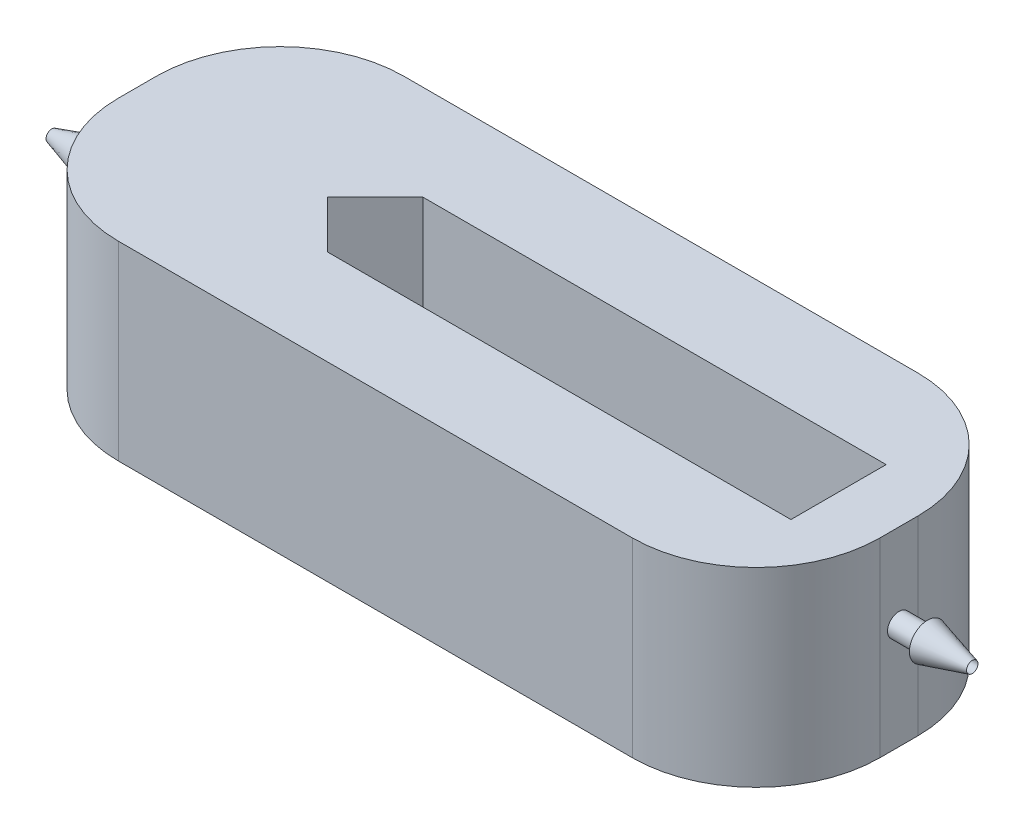
ISO-10303-21;
HEADER;
FILE_DESCRIPTION(('STEP AP214'),'2;1');
FILE_NAME('part.step','',(''),(''),'','','');
FILE_SCHEMA(('AUTOMOTIVE_DESIGN { 1 0 10303 214 1 1 1 1 }'));
ENDSEC;
DATA;
#1=APPLICATION_CONTEXT('core data for automotive mechanical design processes');
#2=APPLICATION_PROTOCOL_DEFINITION('international standard','automotive_design',2000,#1);
#3=PRODUCT_CONTEXT('',#1,'mechanical');
#4=PRODUCT('Part','Part','',(#3));
#5=PRODUCT_RELATED_PRODUCT_CATEGORY('part','',(#4));
#6=PRODUCT_DEFINITION_FORMATION('','',#4);
#7=PRODUCT_DEFINITION_CONTEXT('part definition',#1,'design');
#8=PRODUCT_DEFINITION('design','',#6,#7);
#9=PRODUCT_DEFINITION_SHAPE('','',#8);
#10=(LENGTH_UNIT() NAMED_UNIT(*) SI_UNIT(.MILLI.,.METRE.));
#11=(NAMED_UNIT(*) PLANE_ANGLE_UNIT() SI_UNIT($,.RADIAN.));
#12=(NAMED_UNIT(*) SI_UNIT($,.STERADIAN.) SOLID_ANGLE_UNIT());
#13=UNCERTAINTY_MEASURE_WITH_UNIT(LENGTH_MEASURE(1.E-05),#10,'distance_accuracy_value','');
#14=(GEOMETRIC_REPRESENTATION_CONTEXT(3) GLOBAL_UNCERTAINTY_ASSIGNED_CONTEXT((#13)) GLOBAL_UNIT_ASSIGNED_CONTEXT((#10,
#11,#12)) REPRESENTATION_CONTEXT('',''));
#15=CARTESIAN_POINT('',(0.,0.,0.));
#16=DIRECTION('',(0.,0.,1.));
#17=DIRECTION('',(1.,0.,0.));
#18=AXIS2_PLACEMENT_3D('',#15,#16,#17);
#19=CARTESIAN_POINT('',(43.,51.1119598949633,0.));
#20=DIRECTION('',(-1.,0.,0.));
#21=DIRECTION('',(0.,0.,1.));
#22=AXIS2_PLACEMENT_3D('',#19,#20,#21);
#23=PLANE('',#22);
#24=CARTESIAN_POINT('',(43.,51.1119598949633,0.));
#25=DIRECTION('',(-1.,0.,0.));
#26=DIRECTION('',(0.,0.,1.));
#27=AXIS2_PLACEMENT_3D('',#24,#25,#26);
#28=CIRCLE('',#27,0.800000000000001);
#29=CARTESIAN_POINT('',(43.,51.1119598949633,0.800000000000001));
#30=VERTEX_POINT('',#29);
#31=EDGE_CURVE('E56',#30,#30,#28,.T.);
#32=ORIENTED_EDGE('',*,*,#31,.F.);
#33=EDGE_LOOP('',(#32));
#34=FACE_BOUND('',#33,.T.);
#35=CARTESIAN_POINT('',(43.,51.1119598949633,0.));
#36=DIRECTION('',(-1.,0.,0.));
#37=DIRECTION('',(0.,0.,1.));
#38=AXIS2_PLACEMENT_3D('',#35,#36,#37);
#39=CIRCLE('',#38,1.90135651755513);
#40=CARTESIAN_POINT('',(43.,51.1119598949633,1.90135651755513));
#41=VERTEX_POINT('',#40);
#42=EDGE_CURVE('E11',#41,#41,#39,.T.);
#43=ORIENTED_EDGE('',*,*,#42,.T.);
#44=EDGE_LOOP('',(#43));
#45=FACE_BOUND('',#44,.T.);
#46=ADVANCED_FACE('F53',(#34,#45),#23,.T.);
#47=CARTESIAN_POINT('',(47.7051492827357,51.1119598949633,0.));
#48=DIRECTION('',(-1.,0.,0.));
#49=DIRECTION('',(0.,0.,1.));
#50=AXIS2_PLACEMENT_3D('',#47,#48,#49);
#51=CONICAL_SURFACE('',#50,0.600000000000003,0.269835779667187);
#52=CARTESIAN_POINT('',(47.7051492827357,51.1119598949633,0.));
#53=DIRECTION('',(1.,0.,0.));
#54=DIRECTION('',(0.,0.,-1.));
#55=AXIS2_PLACEMENT_3D('',#52,#53,#54);
#56=CIRCLE('',#55,0.600000000000002);
#57=CARTESIAN_POINT('',(47.7051492827357,51.1119598949633,0.600000000000004));
#58=VERTEX_POINT('',#57);
#59=EDGE_CURVE('E60',#58,#58,#56,.T.);
#60=CARTESIAN_POINT('',(43.,51.1119598949633,1.90135651755513));
#61=CARTESIAN_POINT('',(43.0490119716952,51.1119598949633,1.88780072049726));
#62=CARTESIAN_POINT('',(43.0980239433903,51.1119598949633,1.8742449234394));
#63=CARTESIAN_POINT('',(43.1960478867807,51.1119598949633,1.84713332932367));
#64=CARTESIAN_POINT('',(43.2450598584758,51.1119598949633,1.8335775322658));
#65=CARTESIAN_POINT('',(43.3430838018662,51.1119598949633,1.80646593815007));
#66=CARTESIAN_POINT('',(43.3920957735613,51.1119598949633,1.7929101410922));
#67=CARTESIAN_POINT('',(43.4901197169516,51.1119598949633,1.76579854697647));
#68=CARTESIAN_POINT('',(43.5391316886468,51.1119598949633,1.7522427499186));
#69=CARTESIAN_POINT('',(43.6371556320371,51.1119598949633,1.72513115580287));
#70=CARTESIAN_POINT('',(43.6861676037323,51.1119598949633,1.71157535874501));
#71=CARTESIAN_POINT('',(43.7841915471226,51.1119598949633,1.68446376462928));
#72=CARTESIAN_POINT('',(43.8332035188178,51.1119598949633,1.67090796757141));
#73=CARTESIAN_POINT('',(43.9312274622081,51.1119598949633,1.64379637345568));
#74=CARTESIAN_POINT('',(43.9802394339033,51.1119598949633,1.63024057639781));
#75=CARTESIAN_POINT('',(44.0782633772936,51.1119598949633,1.60312898228208));
#76=CARTESIAN_POINT('',(44.1272753489888,51.1119598949633,1.58957318522421));
#77=CARTESIAN_POINT('',(44.2252992923791,51.1119598949633,1.56246159110848));
#78=CARTESIAN_POINT('',(44.2743112640743,51.1119598949633,1.54890579405062));
#79=CARTESIAN_POINT('',(44.3723352074646,51.1119598949633,1.52179419993488));
#80=CARTESIAN_POINT('',(44.4213471791598,51.1119598949633,1.50823840287702));
#81=CARTESIAN_POINT('',(44.5193711225501,51.1119598949633,1.48112680876129));
#82=CARTESIAN_POINT('',(44.5683830942452,51.1119598949633,1.46757101170342));
#83=CARTESIAN_POINT('',(44.6664070376356,51.1119598949633,1.44045941758769));
#84=CARTESIAN_POINT('',(44.7154190093307,51.1119598949633,1.42690362052982));
#85=CARTESIAN_POINT('',(44.8134429527211,51.1119598949633,1.39979202641409));
#86=CARTESIAN_POINT('',(44.8624549244162,51.1119598949633,1.38623622935623));
#87=CARTESIAN_POINT('',(44.9604788678066,51.1119598949633,1.35912463524049));
#88=CARTESIAN_POINT('',(45.0094908395017,51.1119598949633,1.34556883818263));
#89=CARTESIAN_POINT('',(45.107514782892,51.1119598949633,1.3184572440669));
#90=CARTESIAN_POINT('',(45.1565267545872,51.1119598949633,1.30490144700903));
#91=CARTESIAN_POINT('',(45.2545506979775,51.1119598949633,1.2777898528933));
#92=CARTESIAN_POINT('',(45.3035626696727,51.1119598949633,1.26423405583543));
#93=CARTESIAN_POINT('',(45.401586613063,51.1119598949633,1.2371224617197));
#94=CARTESIAN_POINT('',(45.4505985847582,51.1119598949633,1.22356666466184));
#95=CARTESIAN_POINT('',(45.5486225281485,51.1119598949633,1.1964550705461));
#96=CARTESIAN_POINT('',(45.5976344998437,51.1119598949633,1.18289927348824));
#97=CARTESIAN_POINT('',(45.695658443234,51.1119598949633,1.15578767937251));
#98=CARTESIAN_POINT('',(45.7446704149292,51.1119598949633,1.14223188231464));
#99=CARTESIAN_POINT('',(45.8426943583195,51.1119598949633,1.11512028819891));
#100=CARTESIAN_POINT('',(45.8917063300147,51.1119598949633,1.10156449114104));
#101=CARTESIAN_POINT('',(45.989730273405,51.1119598949633,1.07445289702531));
#102=CARTESIAN_POINT('',(46.0387422451002,51.1119598949633,1.06089709996744));
#103=CARTESIAN_POINT('',(46.1367661884905,51.1119598949633,1.03378550585171));
#104=CARTESIAN_POINT('',(46.1857781601856,51.1119598949633,1.02022970879385));
#105=CARTESIAN_POINT('',(46.283802103576,51.1119598949633,0.993118114678115));
#106=CARTESIAN_POINT('',(46.3328140752711,51.1119598949633,0.979562317620249));
#107=CARTESIAN_POINT('',(46.4308380186615,51.1119598949633,0.952450723504517));
#108=CARTESIAN_POINT('',(46.4798499903566,51.1119598949633,0.938894926446652));
#109=CARTESIAN_POINT('',(46.577873933747,51.1119598949633,0.91178333233092));
#110=CARTESIAN_POINT('',(46.6268859054421,51.1119598949633,0.898227535273054));
#111=CARTESIAN_POINT('',(46.7249098488324,51.1119598949633,0.871115941157322));
#112=CARTESIAN_POINT('',(46.7739218205276,51.1119598949633,0.857560144099456));
#113=CARTESIAN_POINT('',(46.8719457639179,51.1119598949633,0.830448549983725));
#114=CARTESIAN_POINT('',(46.9209577356131,51.1119598949633,0.816892752925859));
#115=CARTESIAN_POINT('',(47.0189816790034,51.1119598949633,0.789781158810127));
#116=CARTESIAN_POINT('',(47.0679936506986,51.1119598949633,0.776225361752261));
#117=CARTESIAN_POINT('',(47.1660175940889,51.1119598949633,0.749113767636529));
#118=CARTESIAN_POINT('',(47.2150295657841,51.1119598949633,0.735557970578663));
#119=CARTESIAN_POINT('',(47.3130535091744,51.1119598949633,0.708446376462931));
#120=CARTESIAN_POINT('',(47.3620654808696,51.1119598949633,0.694890579405065));
#121=CARTESIAN_POINT('',(47.4600894242599,51.1119598949633,0.667778985289334));
#122=CARTESIAN_POINT('',(47.5091013959551,51.1119598949633,0.654223188231468));
#123=CARTESIAN_POINT('',(47.6071253393454,51.1119598949633,0.627111594115736));
#124=CARTESIAN_POINT('',(47.6561373110406,51.1119598949633,0.61355579705787));
#125=CARTESIAN_POINT('',(47.7051492827357,51.1119598949633,0.600000000000004));
#126=B_SPLINE_CURVE_WITH_KNOTS('',3,(#60,#61,#62,#63,#64,#65,#66,#67,#68,#69,#70,#71,#72,#73,
#74,#75,#76,#77,#78,#79,#80,#81,#82,#83,#84,#85,#86,#87,#88,#89,#90,#91,#92,#93,#94,#95,#96,#97,
#98,#99,#100,#101,#102,#103,#104,#105,#106,#107,#108,#109,#110,#111,#112,#113,#114,#115,#116,
#117,#118,#119,#120,#121,#122,#123,#124,#125),.UNSPECIFIED.,.F.,.F.,(4,2,2,2,2,2,2,2,2,2,2,2,2,
2,2,2,2,2,2,2,2,2,2,2,2,2,2,2,2,2,2,2,4),(0.,0.152556209411141,0.305112418822276,
0.45766862823341,0.610224837644544,0.762781047055679,0.915337256466813,1.06789346587795,
1.22044967528909,1.37300588470022,1.52556209411136,1.67811830352249,1.83067451293363,
1.98323072234477,2.1357869317559,2.28834314116704,2.44089935057817,2.59345555998931,
2.74601176940044,2.89856797881158,3.05112418822272,3.20368039763385,3.35623660704499,
3.50879281645612,3.66134902586725,3.81390523527839,3.96646144468953,4.11901765410066,
4.2715738635118,4.42413007292293,4.57668628233407,4.7292424917452,4.88179870115634),.UNSPECIFIED.);
#127=EDGE_CURVE('BSEAM79',#41,#58,#126,.T.);
#128=ORIENTED_EDGE('',*,*,#42,.F.);
#129=ORIENTED_EDGE('',*,*,#59,.F.);
#130=ORIENTED_EDGE('',*,*,#127,.T.);
#131=ORIENTED_EDGE('',*,*,#127,.F.);
#132=EDGE_LOOP('',(#128,#130,#129,#131));
#133=FACE_BOUND('',#132,.T.);
#134=ADVANCED_FACE('F79',(#133),#51,.T.);
#135=CARTESIAN_POINT('',(45.7051492827357,51.1119598949633,0.));
#136=DIRECTION('',(1.,0.,0.));
#137=DIRECTION('',(0.,0.,-1.));
#138=AXIS2_PLACEMENT_3D('',#135,#136,#137);
#139=CYLINDRICAL_SURFACE('',#138,0.600000000000002);
#140=CARTESIAN_POINT('',(45.7051492827357,51.1119598949633,0.));
#141=DIRECTION('',(1.,0.,0.));
#142=DIRECTION('',(0.,0.,-1.));
#143=AXIS2_PLACEMENT_3D('',#140,#141,#142);
#144=CIRCLE('',#143,0.600000000000002);
#145=CARTESIAN_POINT('',(45.7051492827357,51.1119598949633,-0.600000000000002));
#146=VERTEX_POINT('',#145);
#147=EDGE_CURVE('E64',#146,#146,#144,.T.);
#148=ORIENTED_EDGE('',*,*,#147,.F.);
#149=EDGE_LOOP('',(#148));
#150=FACE_BOUND('',#149,.T.);
#151=ORIENTED_EDGE('',*,*,#59,.T.);
#152=EDGE_LOOP('',(#151));
#153=FACE_BOUND('',#152,.T.);
#154=ADVANCED_FACE('F85',(#150,#153),#139,.F.);
#155=CARTESIAN_POINT('',(10.7051492827357,51.1119598949633,0.));
#156=DIRECTION('',(1.,0.,0.));
#157=DIRECTION('',(0.,0.,-1.));
#158=AXIS2_PLACEMENT_3D('',#155,#156,#157);
#159=CYLINDRICAL_SURFACE('',#158,0.800000000000001);
#160=ORIENTED_EDGE('',*,*,#31,.T.);
#161=EDGE_LOOP('',(#160));
#162=FACE_BOUND('',#161,.T.);
#163=CARTESIAN_POINT('',(45.7051492827357,51.1119598949633,0.));
#164=DIRECTION('',(1.,0.,0.));
#165=DIRECTION('',(0.,0.,-1.));
#166=AXIS2_PLACEMENT_3D('',#163,#164,#165);
#167=CIRCLE('',#166,0.800000000000001);
#168=CARTESIAN_POINT('',(45.7051492827357,51.1119598949633,-0.800000000000001));
#169=VERTEX_POINT('',#168);
#170=EDGE_CURVE('E69',#169,#169,#167,.T.);
#171=ORIENTED_EDGE('',*,*,#170,.T.);
#172=EDGE_LOOP('',(#171));
#173=FACE_BOUND('',#172,.T.);
#174=ADVANCED_FACE('F76',(#162,#173),#159,.F.);
#175=CARTESIAN_POINT('',(45.7051492827357,51.1119598949633,0.));
#176=DIRECTION('',(1.,0.,0.));
#177=DIRECTION('',(0.,0.,-1.));
#178=AXIS2_PLACEMENT_3D('',#175,#176,#177);
#179=PLANE('',#178);
#180=ORIENTED_EDGE('',*,*,#147,.T.);
#181=EDGE_LOOP('',(#180));
#182=FACE_BOUND('',#181,.T.);
#183=ORIENTED_EDGE('',*,*,#170,.F.);
#184=EDGE_LOOP('',(#183));
#185=FACE_BOUND('',#184,.T.);
#186=ADVANCED_FACE('F94',(#182,#185),#179,.F.);
#187=CLOSED_SHELL('',(#46,#134,#154,#174,#186));
#188=MANIFOLD_SOLID_BREP('B2',#187);
#189=CARTESIAN_POINT('',(40.,60.,15.));
#190=DIRECTION('',(-1.,0.,0.));
#191=DIRECTION('',(0.,0.,1.));
#192=AXIS2_PLACEMENT_3D('',#189,#190,#191);
#193=PLANE('',#192);
#194=CARTESIAN_POINT('',(40.,51.1119598949633,0.));
#195=DIRECTION('',(-1.,0.,0.));
#196=DIRECTION('',(0.,0.,1.));
#197=AXIS2_PLACEMENT_3D('',#194,#195,#196);
#198=CIRCLE('',#197,1.2);
#199=CARTESIAN_POINT('',(40.,51.1119598949633,1.2));
#200=VERTEX_POINT('',#199);
#201=EDGE_CURVE('E138',#200,#200,#198,.F.);
#202=ORIENTED_EDGE('',*,*,#201,.F.);
#203=EDGE_LOOP('',(#202));
#204=FACE_BOUND('',#203,.T.);
#205=DIRECTION('',(0.,0.,1.));
#206=VECTOR('',#205,1.);
#207=CARTESIAN_POINT('',(40.,40.,15.));
#208=LINE('',#207,#206);
#209=CARTESIAN_POINT('',(40.,40.,-2.));
#210=VERTEX_POINT('',#209);
#211=CARTESIAN_POINT('',(40.,40.,2.));
#212=VERTEX_POINT('',#211);
#213=EDGE_CURVE('E268',#210,#212,#208,.T.);
#214=ORIENTED_EDGE('',*,*,#213,.F.);
#215=DIRECTION('',(0.,-1.,0.));
#216=VECTOR('',#215,1.);
#217=CARTESIAN_POINT('',(40.,60.,-2.));
#218=LINE('',#217,#216);
#219=CARTESIAN_POINT('',(40.,60.,-2.));
#220=VERTEX_POINT('',#219);
#221=EDGE_CURVE('E271',#210,#220,#218,.F.);
#222=ORIENTED_EDGE('',*,*,#221,.T.);
#223=DIRECTION('',(0.,0.,-1.));
#224=VECTOR('',#223,1.);
#225=CARTESIAN_POINT('',(40.,60.,15.));
#226=LINE('',#225,#224);
#227=CARTESIAN_POINT('',(40.,60.,2.));
#228=VERTEX_POINT('',#227);
#229=EDGE_CURVE('E374',#228,#220,#226,.T.);
#230=ORIENTED_EDGE('',*,*,#229,.F.);
#231=DIRECTION('',(0.,-1.,0.));
#232=VECTOR('',#231,1.);
#233=CARTESIAN_POINT('',(40.,60.,2.));
#234=LINE('',#233,#232);
#235=EDGE_CURVE('E274',#228,#212,#234,.T.);
#236=ORIENTED_EDGE('',*,*,#235,.T.);
#237=EDGE_LOOP('',(#214,#222,#230,#236));
#238=FACE_BOUND('',#237,.T.);
#239=ADVANCED_FACE('F130',(#204,#238),#193,.F.);
#240=CARTESIAN_POINT('',(-40.,60.,-15.));
#241=DIRECTION('',(0.,0.,1.));
#242=DIRECTION('',(1.,0.,0.));
#243=AXIS2_PLACEMENT_3D('',#240,#241,#242);
#244=PLANE('',#243);
#245=DIRECTION('',(1.,0.,0.));
#246=VECTOR('',#245,1.);
#247=CARTESIAN_POINT('',(-40.,40.,-15.));
#248=LINE('',#247,#246);
#249=CARTESIAN_POINT('',(-27.,40.,-15.));
#250=VERTEX_POINT('',#249);
#251=CARTESIAN_POINT('',(27.,40.,-15.));
#252=VERTEX_POINT('',#251);
#253=EDGE_CURVE('E277',#250,#252,#248,.T.);
#254=ORIENTED_EDGE('',*,*,#253,.F.);
#255=DIRECTION('',(0.,-1.,0.));
#256=VECTOR('',#255,1.);
#257=CARTESIAN_POINT('',(-27.,60.,-15.));
#258=LINE('',#257,#256);
#259=CARTESIAN_POINT('',(-27.,60.,-15.));
#260=VERTEX_POINT('',#259);
#261=EDGE_CURVE('E305',#250,#260,#258,.F.);
#262=ORIENTED_EDGE('',*,*,#261,.T.);
#263=DIRECTION('',(-1.,0.,0.));
#264=VECTOR('',#263,1.);
#265=CARTESIAN_POINT('',(-40.,60.,-15.));
#266=LINE('',#265,#264);
#267=CARTESIAN_POINT('',(27.,60.,-15.));
#268=VERTEX_POINT('',#267);
#269=EDGE_CURVE('E298',#268,#260,#266,.T.);
#270=ORIENTED_EDGE('',*,*,#269,.F.);
#271=DIRECTION('',(0.,-1.,0.));
#272=VECTOR('',#271,1.);
#273=CARTESIAN_POINT('',(27.,60.,-15.));
#274=LINE('',#273,#272);
#275=EDGE_CURVE('E288',#268,#252,#274,.T.);
#276=ORIENTED_EDGE('',*,*,#275,.T.);
#277=EDGE_LOOP('',(#254,#262,#270,#276));
#278=FACE_BOUND('',#277,.T.);
#279=ADVANCED_FACE('F264',(#278),#244,.F.);
#280=CARTESIAN_POINT('',(-40.,60.,15.));
#281=DIRECTION('',(1.,0.,0.));
#282=DIRECTION('',(0.,0.,-1.));
#283=AXIS2_PLACEMENT_3D('',#280,#281,#282);
#284=PLANE('',#283);
#285=CARTESIAN_POINT('',(-40.,51.1119598949633,0.));
#286=DIRECTION('',(1.,0.,0.));
#287=DIRECTION('',(0.,0.,-1.));
#288=AXIS2_PLACEMENT_3D('',#285,#286,#287);
#289=CIRCLE('',#288,1.5);
#290=CARTESIAN_POINT('',(-40.,51.1119598949633,-1.5));
#291=VERTEX_POINT('',#290);
#292=EDGE_CURVE('E390',#291,#291,#289,.F.);
#293=ORIENTED_EDGE('',*,*,#292,.F.);
#294=EDGE_LOOP('',(#293));
#295=FACE_BOUND('',#294,.T.);
#296=DIRECTION('',(0.,0.,-1.));
#297=VECTOR('',#296,1.);
#298=CARTESIAN_POINT('',(-40.,40.,15.));
#299=LINE('',#298,#297);
#300=CARTESIAN_POINT('',(-40.,40.,2.));
#301=VERTEX_POINT('',#300);
#302=CARTESIAN_POINT('',(-40.,40.,-2.));
#303=VERTEX_POINT('',#302);
#304=EDGE_CURVE('E229',#301,#303,#299,.T.);
#305=ORIENTED_EDGE('',*,*,#304,.F.);
#306=DIRECTION('',(0.,-1.,0.));
#307=VECTOR('',#306,1.);
#308=CARTESIAN_POINT('',(-40.,60.,2.));
#309=LINE('',#308,#307);
#310=CARTESIAN_POINT('',(-40.,60.,2.));
#311=VERTEX_POINT('',#310);
#312=EDGE_CURVE('E239',#301,#311,#309,.F.);
#313=ORIENTED_EDGE('',*,*,#312,.T.);
#314=DIRECTION('',(0.,0.,1.));
#315=VECTOR('',#314,1.);
#316=CARTESIAN_POINT('',(-40.,60.,15.));
#317=LINE('',#316,#315);
#318=CARTESIAN_POINT('',(-40.,60.,-2.));
#319=VERTEX_POINT('',#318);
#320=EDGE_CURVE('E296',#319,#311,#317,.T.);
#321=ORIENTED_EDGE('',*,*,#320,.F.);
#322=DIRECTION('',(0.,-1.,0.));
#323=VECTOR('',#322,1.);
#324=CARTESIAN_POINT('',(-40.,60.,-2.));
#325=LINE('',#324,#323);
#326=EDGE_CURVE('E242',#319,#303,#325,.T.);
#327=ORIENTED_EDGE('',*,*,#326,.T.);
#328=EDGE_LOOP('',(#305,#313,#321,#327));
#329=FACE_BOUND('',#328,.T.);
#330=ADVANCED_FACE('F237',(#295,#329),#284,.F.);
#331=CARTESIAN_POINT('',(-40.,60.,15.));
#332=DIRECTION('',(0.,0.,-1.));
#333=DIRECTION('',(-1.,0.,0.));
#334=AXIS2_PLACEMENT_3D('',#331,#332,#333);
#335=PLANE('',#334);
#336=DIRECTION('',(-1.,0.,0.));
#337=VECTOR('',#336,1.);
#338=CARTESIAN_POINT('',(-40.,40.,15.));
#339=LINE('',#338,#337);
#340=CARTESIAN_POINT('',(27.,40.,15.));
#341=VERTEX_POINT('',#340);
#342=CARTESIAN_POINT('',(-27.,40.,15.));
#343=VERTEX_POINT('',#342);
#344=EDGE_CURVE('E153',#341,#343,#339,.T.);
#345=ORIENTED_EDGE('',*,*,#344,.F.);
#346=DIRECTION('',(0.,-1.,0.));
#347=VECTOR('',#346,1.);
#348=CARTESIAN_POINT('',(27.,60.,15.));
#349=LINE('',#348,#347);
#350=CARTESIAN_POINT('',(27.,60.,15.));
#351=VERTEX_POINT('',#350);
#352=EDGE_CURVE('E256',#341,#351,#349,.F.);
#353=ORIENTED_EDGE('',*,*,#352,.T.);
#354=DIRECTION('',(1.,0.,0.));
#355=VECTOR('',#354,1.);
#356=CARTESIAN_POINT('',(-40.,60.,15.));
#357=LINE('',#356,#355);
#358=CARTESIAN_POINT('',(-27.,60.,15.));
#359=VERTEX_POINT('',#358);
#360=EDGE_CURVE('E301',#359,#351,#357,.T.);
#361=ORIENTED_EDGE('',*,*,#360,.F.);
#362=DIRECTION('',(0.,-1.,0.));
#363=VECTOR('',#362,1.);
#364=CARTESIAN_POINT('',(-27.,60.,15.));
#365=LINE('',#364,#363);
#366=EDGE_CURVE('E249',#359,#343,#365,.T.);
#367=ORIENTED_EDGE('',*,*,#366,.T.);
#368=EDGE_LOOP('',(#345,#353,#361,#367));
#369=FACE_BOUND('',#368,.T.);
#370=ADVANCED_FACE('F403',(#369),#335,.F.);
#371=CARTESIAN_POINT('',(-19.9999999999997,-15.,-3.35235311732518E-13));
#372=DIRECTION('',(-0.707106781186548,0.,-0.707106781186548));
#373=DIRECTION('',(-0.707106781186548,0.,0.707106781186548));
#374=AXIS2_PLACEMENT_3D('',#371,#372,#373);
#375=PLANE('',#374);
#376=DIRECTION('',(-0.707106781186548,0.,0.707106781186548));
#377=VECTOR('',#376,1.);
#378=CARTESIAN_POINT('',(-19.9999999999997,40.,-3.35235311732518E-13));
#379=LINE('',#378,#377);
#380=CARTESIAN_POINT('',(-15.,40.,-5.));
#381=VERTEX_POINT('',#380);
#382=CARTESIAN_POINT('',(-19.9999999999997,40.,-3.35235311732518E-13));
#383=VERTEX_POINT('',#382);
#384=EDGE_CURVE('E145',#381,#383,#379,.T.);
#385=ORIENTED_EDGE('',*,*,#384,.F.);
#386=DIRECTION('',(0.,1.,0.));
#387=VECTOR('',#386,1.);
#388=CARTESIAN_POINT('',(-15.,-15.,-5.));
#389=LINE('',#388,#387);
#390=CARTESIAN_POINT('',(-15.,60.,-5.));
#391=VERTEX_POINT('',#390);
#392=EDGE_CURVE('E372',#381,#391,#389,.T.);
#393=ORIENTED_EDGE('',*,*,#392,.T.);
#394=DIRECTION('',(-0.707106781186548,0.,0.707106781186548));
#395=VECTOR('',#394,1.);
#396=CARTESIAN_POINT('',(-19.9999999999997,60.,-3.35235311732518E-13));
#397=LINE('',#396,#395);
#398=CARTESIAN_POINT('',(-19.9999999999997,60.,-3.34801630863524E-13));
#399=VERTEX_POINT('',#398);
#400=EDGE_CURVE('E356',#391,#399,#397,.T.);
#401=ORIENTED_EDGE('',*,*,#400,.T.);
#402=DIRECTION('',(0.,1.,0.));
#403=VECTOR('',#402,1.);
#404=CARTESIAN_POINT('',(-19.9999999999997,-15.,-3.35235311732518E-13));
#405=LINE('',#404,#403);
#406=CARTESIAN_POINT('',(-19.9999999999997,51.9119598949633,-3.35235311732518E-13));
#407=VERTEX_POINT('',#406);
#408=EDGE_CURVE('E371',#407,#399,#405,.T.);
#409=ORIENTED_EDGE('',*,*,#408,.F.);
#410=CARTESIAN_POINT('',(-20.,51.1119598949633,0.));
#411=DIRECTION('',(-0.707106781186548,0.,-0.707106781186548));
#412=DIRECTION('',(-0.707106781186548,0.,0.707106781186548));
#413=AXIS2_PLACEMENT_3D('',#410,#411,#412);
#414=ELLIPSE('',#413,1.13137084989848,0.800000000000001);
#415=CARTESIAN_POINT('',(-19.9999999999997,50.3119598949634,-3.35235311732518E-13));
#416=VERTEX_POINT('',#415);
#417=EDGE_CURVE('E347',#407,#416,#414,.T.);
#418=ORIENTED_EDGE('',*,*,#417,.T.);
#419=EDGE_CURVE('E381',#383,#416,#405,.T.);
#420=ORIENTED_EDGE('',*,*,#419,.F.);
#421=EDGE_LOOP('',(#385,#393,#401,#409,#418,#420));
#422=FACE_BOUND('',#421,.T.);
#423=ADVANCED_FACE('F425',(#422),#375,.F.);
#424=CARTESIAN_POINT('',(-15.,-15.,-5.));
#425=DIRECTION('',(0.,0.,-1.));
#426=DIRECTION('',(-1.,0.,0.));
#427=AXIS2_PLACEMENT_3D('',#424,#425,#426);
#428=PLANE('',#427);
#429=DIRECTION('',(-1.,0.,0.));
#430=VECTOR('',#429,1.);
#431=CARTESIAN_POINT('',(-15.,40.,-5.));
#432=LINE('',#431,#430);
#433=CARTESIAN_POINT('',(33.657016572987,40.,-5.));
#434=VERTEX_POINT('',#433);
#435=EDGE_CURVE('E318',#434,#381,#432,.T.);
#436=ORIENTED_EDGE('',*,*,#435,.F.);
#437=DIRECTION('',(0.,1.,0.));
#438=VECTOR('',#437,1.);
#439=CARTESIAN_POINT('',(33.657016572987,-15.,-5.));
#440=LINE('',#439,#438);
#441=CARTESIAN_POINT('',(33.657016572987,60.,-5.));
#442=VERTEX_POINT('',#441);
#443=EDGE_CURVE('E375',#434,#442,#440,.T.);
#444=ORIENTED_EDGE('',*,*,#443,.T.);
#445=DIRECTION('',(-1.,0.,0.));
#446=VECTOR('',#445,1.);
#447=CARTESIAN_POINT('',(-15.,60.,-5.));
#448=LINE('',#447,#446);
#449=EDGE_CURVE('E368',#442,#391,#448,.T.);
#450=ORIENTED_EDGE('',*,*,#449,.T.);
#451=ORIENTED_EDGE('',*,*,#392,.F.);
#452=EDGE_LOOP('',(#436,#444,#450,#451));
#453=FACE_BOUND('',#452,.T.);
#454=ADVANCED_FACE('F429',(#453),#428,.F.);
#455=CARTESIAN_POINT('',(33.657016572987,-15.,-5.));
#456=DIRECTION('',(1.,0.,0.));
#457=DIRECTION('',(0.,0.,-1.));
#458=AXIS2_PLACEMENT_3D('',#455,#456,#457);
#459=PLANE('',#458);
#460=CARTESIAN_POINT('',(33.657016572987,51.1119598949633,0.));
#461=DIRECTION('',(1.,0.,0.));
#462=DIRECTION('',(0.,0.,-1.));
#463=AXIS2_PLACEMENT_3D('',#460,#461,#462);
#464=CIRCLE('',#463,0.800000000000001);
#465=CARTESIAN_POINT('',(33.657016572987,51.1119598949633,-0.800000000000001));
#466=VERTEX_POINT('',#465);
#467=EDGE_CURVE('E350',#466,#466,#464,.T.);
#468=ORIENTED_EDGE('',*,*,#467,.T.);
#469=EDGE_LOOP('',(#468));
#470=FACE_BOUND('',#469,.T.);
#471=DIRECTION('',(0.,0.,-1.));
#472=VECTOR('',#471,1.);
#473=CARTESIAN_POINT('',(33.657016572987,40.,-5.));
#474=LINE('',#473,#472);
#475=CARTESIAN_POINT('',(33.657016572987,40.,5.));
#476=VERTEX_POINT('',#475);
#477=EDGE_CURVE('E316',#476,#434,#474,.T.);
#478=ORIENTED_EDGE('',*,*,#477,.F.);
#479=DIRECTION('',(0.,1.,0.));
#480=VECTOR('',#479,1.);
#481=CARTESIAN_POINT('',(33.657016572987,-15.,5.));
#482=LINE('',#481,#480);
#483=CARTESIAN_POINT('',(33.657016572987,60.,5.));
#484=VERTEX_POINT('',#483);
#485=EDGE_CURVE('E377',#476,#484,#482,.T.);
#486=ORIENTED_EDGE('',*,*,#485,.T.);
#487=DIRECTION('',(0.,0.,-1.));
#488=VECTOR('',#487,1.);
#489=CARTESIAN_POINT('',(33.657016572987,60.,-5.));
#490=LINE('',#489,#488);
#491=EDGE_CURVE('E365',#484,#442,#490,.T.);
#492=ORIENTED_EDGE('',*,*,#491,.T.);
#493=ORIENTED_EDGE('',*,*,#443,.F.);
#494=EDGE_LOOP('',(#478,#486,#492,#493));
#495=FACE_BOUND('',#494,.T.);
#496=ADVANCED_FACE('F443',(#470,#495),#459,.F.);
#497=CARTESIAN_POINT('',(33.657016572987,-15.,5.));
#498=DIRECTION('',(0.,0.,1.));
#499=DIRECTION('',(1.,0.,0.));
#500=AXIS2_PLACEMENT_3D('',#497,#498,#499);
#501=PLANE('',#500);
#502=DIRECTION('',(1.,0.,0.));
#503=VECTOR('',#502,1.);
#504=CARTESIAN_POINT('',(33.657016572987,40.,5.));
#505=LINE('',#504,#503);
#506=CARTESIAN_POINT('',(-14.9999999999993,40.,5.));
#507=VERTEX_POINT('',#506);
#508=EDGE_CURVE('E314',#507,#476,#505,.T.);
#509=ORIENTED_EDGE('',*,*,#508,.F.);
#510=DIRECTION('',(0.,1.,0.));
#511=VECTOR('',#510,1.);
#512=CARTESIAN_POINT('',(-14.9999999999993,-15.,5.));
#513=LINE('',#512,#511);
#514=CARTESIAN_POINT('',(-14.9999999999993,60.,5.));
#515=VERTEX_POINT('',#514);
#516=EDGE_CURVE('E379',#507,#515,#513,.T.);
#517=ORIENTED_EDGE('',*,*,#516,.T.);
#518=DIRECTION('',(1.,0.,0.));
#519=VECTOR('',#518,1.);
#520=CARTESIAN_POINT('',(33.657016572987,60.,5.));
#521=LINE('',#520,#519);
#522=EDGE_CURVE('E362',#515,#484,#521,.T.);
#523=ORIENTED_EDGE('',*,*,#522,.T.);
#524=ORIENTED_EDGE('',*,*,#485,.F.);
#525=EDGE_LOOP('',(#509,#517,#523,#524));
#526=FACE_BOUND('',#525,.T.);
#527=ADVANCED_FACE('F439',(#526),#501,.F.);
#528=CARTESIAN_POINT('',(-14.9999999999993,-15.,5.));
#529=DIRECTION('',(-0.707106781186547,0.,0.707106781186548));
#530=DIRECTION('',(0.707106781186548,0.,0.707106781186547));
#531=AXIS2_PLACEMENT_3D('',#528,#529,#530);
#532=PLANE('',#531);
#533=DIRECTION('',(0.707106781186548,0.,0.707106781186547));
#534=VECTOR('',#533,1.);
#535=CARTESIAN_POINT('',(-14.9999999999993,40.,5.));
#536=LINE('',#535,#534);
#537=EDGE_CURVE('E312',#383,#507,#536,.T.);
#538=ORIENTED_EDGE('',*,*,#537,.F.);
#539=ORIENTED_EDGE('',*,*,#419,.T.);
#540=CARTESIAN_POINT('',(-19.9999999999993,51.1119598949633,0.));
#541=DIRECTION('',(-0.707106781186547,0.,0.707106781186548));
#542=DIRECTION('',(-0.707106781186548,0.,-0.707106781186547));
#543=AXIS2_PLACEMENT_3D('',#540,#541,#542);
#544=ELLIPSE('',#543,1.13137084989848,0.800000000000001);
#545=EDGE_CURVE('E387',#416,#407,#544,.T.);
#546=ORIENTED_EDGE('',*,*,#545,.T.);
#547=ORIENTED_EDGE('',*,*,#408,.T.);
#548=DIRECTION('',(0.707106781186548,0.,0.707106781186547));
#549=VECTOR('',#548,1.);
#550=CARTESIAN_POINT('',(-14.9999999999993,60.,5.));
#551=LINE('',#550,#549);
#552=EDGE_CURVE('E359',#399,#515,#551,.T.);
#553=ORIENTED_EDGE('',*,*,#552,.T.);
#554=ORIENTED_EDGE('',*,*,#516,.F.);
#555=EDGE_LOOP('',(#538,#539,#546,#547,#553,#554));
#556=FACE_BOUND('',#555,.T.);
#557=ADVANCED_FACE('F411',(#556),#532,.F.);
#558=CARTESIAN_POINT('',(27.,60.,-2.));
#559=DIRECTION('',(0.,-1.,0.));
#560=DIRECTION('',(0.,0.,-1.));
#561=AXIS2_PLACEMENT_3D('',#558,#559,#560);
#562=CYLINDRICAL_SURFACE('',#561,13.);
#563=ORIENTED_EDGE('',*,*,#221,.F.);
#564=CARTESIAN_POINT('',(27.,40.,-2.));
#565=DIRECTION('',(0.,-1.,0.));
#566=DIRECTION('',(0.,0.,-1.));
#567=AXIS2_PLACEMENT_3D('',#564,#565,#566);
#568=CIRCLE('',#567,13.);
#569=EDGE_CURVE('E276',#210,#252,#568,.F.);
#570=ORIENTED_EDGE('',*,*,#569,.T.);
#571=ORIENTED_EDGE('',*,*,#275,.F.);
#572=CARTESIAN_POINT('',(27.,60.,-2.));
#573=DIRECTION('',(0.,-1.,0.));
#574=DIRECTION('',(0.,0.,-1.));
#575=AXIS2_PLACEMENT_3D('',#572,#573,#574);
#576=CIRCLE('',#575,13.);
#577=EDGE_CURVE('E247',#220,#268,#576,.F.);
#578=ORIENTED_EDGE('',*,*,#577,.F.);
#579=EDGE_LOOP('',(#563,#570,#571,#578));
#580=FACE_BOUND('',#579,.T.);
#581=ADVANCED_FACE('F282',(#580),#562,.T.);
#582=CARTESIAN_POINT('',(-27.,60.,-2.));
#583=DIRECTION('',(0.,-1.,0.));
#584=DIRECTION('',(0.,0.,-1.));
#585=AXIS2_PLACEMENT_3D('',#582,#583,#584);
#586=CYLINDRICAL_SURFACE('',#585,13.);
#587=ORIENTED_EDGE('',*,*,#261,.F.);
#588=CARTESIAN_POINT('',(-27.,40.,-2.));
#589=DIRECTION('',(0.,-1.,0.));
#590=DIRECTION('',(0.,0.,-1.));
#591=AXIS2_PLACEMENT_3D('',#588,#589,#590);
#592=CIRCLE('',#591,13.);
#593=EDGE_CURVE('E304',#250,#303,#592,.F.);
#594=ORIENTED_EDGE('',*,*,#593,.T.);
#595=ORIENTED_EDGE('',*,*,#326,.F.);
#596=CARTESIAN_POINT('',(-27.,60.,-2.));
#597=DIRECTION('',(0.,-1.,0.));
#598=DIRECTION('',(0.,0.,-1.));
#599=AXIS2_PLACEMENT_3D('',#596,#597,#598);
#600=CIRCLE('',#599,13.);
#601=EDGE_CURVE('E251',#260,#319,#600,.F.);
#602=ORIENTED_EDGE('',*,*,#601,.F.);
#603=EDGE_LOOP('',(#587,#594,#595,#602));
#604=FACE_BOUND('',#603,.T.);
#605=ADVANCED_FACE('F303',(#604),#586,.T.);
#606=CARTESIAN_POINT('',(27.,60.,2.));
#607=DIRECTION('',(0.,-1.,0.));
#608=DIRECTION('',(0.,0.,-1.));
#609=AXIS2_PLACEMENT_3D('',#606,#607,#608);
#610=CYLINDRICAL_SURFACE('',#609,13.);
#611=ORIENTED_EDGE('',*,*,#352,.F.);
#612=CARTESIAN_POINT('',(27.,40.,2.));
#613=DIRECTION('',(0.,-1.,0.));
#614=DIRECTION('',(0.,0.,-1.));
#615=AXIS2_PLACEMENT_3D('',#612,#613,#614);
#616=CIRCLE('',#615,13.);
#617=EDGE_CURVE('E243',#341,#212,#616,.F.);
#618=ORIENTED_EDGE('',*,*,#617,.T.);
#619=ORIENTED_EDGE('',*,*,#235,.F.);
#620=CARTESIAN_POINT('',(27.,60.,2.));
#621=DIRECTION('',(0.,-1.,0.));
#622=DIRECTION('',(0.,0.,-1.));
#623=AXIS2_PLACEMENT_3D('',#620,#621,#622);
#624=CIRCLE('',#623,13.);
#625=EDGE_CURVE('E286',#351,#228,#624,.F.);
#626=ORIENTED_EDGE('',*,*,#625,.F.);
#627=EDGE_LOOP('',(#611,#618,#619,#626));
#628=FACE_BOUND('',#627,.T.);
#629=ADVANCED_FACE('F413',(#628),#610,.T.);
#630=CARTESIAN_POINT('',(-27.,60.,2.));
#631=DIRECTION('',(0.,-1.,0.));
#632=DIRECTION('',(0.,0.,-1.));
#633=AXIS2_PLACEMENT_3D('',#630,#631,#632);
#634=CYLINDRICAL_SURFACE('',#633,13.);
#635=ORIENTED_EDGE('',*,*,#312,.F.);
#636=CARTESIAN_POINT('',(-27.,40.,2.));
#637=DIRECTION('',(0.,-1.,0.));
#638=DIRECTION('',(0.,0.,-1.));
#639=AXIS2_PLACEMENT_3D('',#636,#637,#638);
#640=CIRCLE('',#639,13.);
#641=EDGE_CURVE('E51',#301,#343,#640,.F.);
#642=ORIENTED_EDGE('',*,*,#641,.T.);
#643=ORIENTED_EDGE('',*,*,#366,.F.);
#644=CARTESIAN_POINT('',(-27.,60.,2.));
#645=DIRECTION('',(0.,-1.,0.));
#646=DIRECTION('',(0.,0.,-1.));
#647=AXIS2_PLACEMENT_3D('',#644,#645,#646);
#648=CIRCLE('',#647,13.);
#649=EDGE_CURVE('E246',#311,#359,#648,.F.);
#650=ORIENTED_EDGE('',*,*,#649,.F.);
#651=EDGE_LOOP('',(#635,#642,#643,#650));
#652=FACE_BOUND('',#651,.T.);
#653=ADVANCED_FACE('F132',(#652),#634,.T.);
#654=CARTESIAN_POINT('',(-40.,51.1119598949633,0.));
#655=DIRECTION('',(1.,0.,0.));
#656=DIRECTION('',(0.,0.,-1.));
#657=AXIS2_PLACEMENT_3D('',#654,#655,#656);
#658=CIRCLE('',#657,0.800000000000001);
#659=CARTESIAN_POINT('',(-40.,51.1119598949633,-0.800000000000001));
#660=VERTEX_POINT('',#659);
#661=EDGE_CURVE('E353',#660,#660,#658,.T.);
#662=ORIENTED_EDGE('',*,*,#661,.T.);
#663=EDGE_LOOP('',(#662));
#664=FACE_BOUND('',#663,.T.);
#665=CARTESIAN_POINT('',(-40.,51.1119598949633,0.));
#666=DIRECTION('',(-1.,0.,0.));
#667=DIRECTION('',(0.,0.,1.));
#668=AXIS2_PLACEMENT_3D('',#665,#666,#667);
#669=CIRCLE('',#668,1.2);
#670=CARTESIAN_POINT('',(-40.,51.1119598949633,1.2));
#671=VERTEX_POINT('',#670);
#672=EDGE_CURVE('E341',#671,#671,#669,.T.);
#673=ORIENTED_EDGE('',*,*,#672,.T.);
#674=EDGE_LOOP('',(#673));
#675=FACE_BOUND('',#674,.T.);
#676=ADVANCED_FACE('F406',(#664,#675),#284,.F.);
#677=CARTESIAN_POINT('',(0.,60.,0.));
#678=DIRECTION('',(0.,-1.,0.));
#679=DIRECTION('',(0.,0.,-1.));
#680=AXIS2_PLACEMENT_3D('',#677,#678,#679);
#681=PLANE('',#680);
#682=ORIENTED_EDGE('',*,*,#552,.F.);
#683=ORIENTED_EDGE('',*,*,#400,.F.);
#684=ORIENTED_EDGE('',*,*,#449,.F.);
#685=ORIENTED_EDGE('',*,*,#491,.F.);
#686=ORIENTED_EDGE('',*,*,#522,.F.);
#687=EDGE_LOOP('',(#682,#683,#684,#685,#686));
#688=FACE_BOUND('',#687,.T.);
#689=ORIENTED_EDGE('',*,*,#229,.T.);
#690=ORIENTED_EDGE('',*,*,#577,.T.);
#691=ORIENTED_EDGE('',*,*,#269,.T.);
#692=ORIENTED_EDGE('',*,*,#601,.T.);
#693=ORIENTED_EDGE('',*,*,#320,.T.);
#694=ORIENTED_EDGE('',*,*,#649,.T.);
#695=ORIENTED_EDGE('',*,*,#360,.T.);
#696=ORIENTED_EDGE('',*,*,#625,.T.);
#697=EDGE_LOOP('',(#689,#690,#691,#692,#693,#694,#695,#696));
#698=FACE_BOUND('',#697,.T.);
#699=ADVANCED_FACE('F295',(#688,#698),#681,.F.);
#700=CARTESIAN_POINT('',(40.,51.1119598949633,0.));
#701=DIRECTION('',(-1.,0.,0.));
#702=DIRECTION('',(0.,0.,1.));
#703=AXIS2_PLACEMENT_3D('',#700,#701,#702);
#704=CYLINDRICAL_SURFACE('',#703,0.800000000000001);
#705=ORIENTED_EDGE('',*,*,#545,.F.);
#706=ORIENTED_EDGE('',*,*,#417,.F.);
#707=EDGE_LOOP('',(#705,#706));
#708=FACE_BOUND('',#707,.T.);
#709=ORIENTED_EDGE('',*,*,#661,.F.);
#710=EDGE_LOOP('',(#709));
#711=FACE_BOUND('',#710,.T.);
#712=ADVANCED_FACE('F434',(#708,#711),#704,.F.);
#713=ORIENTED_EDGE('',*,*,#467,.F.);
#714=EDGE_LOOP('',(#713));
#715=FACE_BOUND('',#714,.T.);
#716=CARTESIAN_POINT('',(43.,51.1119598949633,0.));
#717=DIRECTION('',(1.,0.,0.));
#718=DIRECTION('',(0.,0.,-1.));
#719=AXIS2_PLACEMENT_3D('',#716,#717,#718);
#720=CIRCLE('',#719,0.800000000000001);
#721=CARTESIAN_POINT('',(43.,51.1119598949633,-0.800000000000001));
#722=VERTEX_POINT('',#721);
#723=EDGE_CURVE('E321',#722,#722,#720,.T.);
#724=ORIENTED_EDGE('',*,*,#723,.T.);
#725=EDGE_LOOP('',(#724));
#726=FACE_BOUND('',#725,.T.);
#727=ADVANCED_FACE('F453',(#715,#726),#704,.F.);
#728=CARTESIAN_POINT('',(-43.,51.1119598949633,0.));
#729=DIRECTION('',(1.,0.,0.));
#730=DIRECTION('',(0.,0.,-1.));
#731=AXIS2_PLACEMENT_3D('',#728,#729,#730);
#732=CYLINDRICAL_SURFACE('',#731,1.5);
#733=CARTESIAN_POINT('',(-43.,51.1119598949633,0.));
#734=DIRECTION('',(-1.,0.,0.));
#735=DIRECTION('',(0.,0.,1.));
#736=AXIS2_PLACEMENT_3D('',#733,#734,#735);
#737=CIRCLE('',#736,1.5);
#738=CARTESIAN_POINT('',(-43.,51.1119598949633,1.5));
#739=VERTEX_POINT('',#738);
#740=EDGE_CURVE('E344',#739,#739,#737,.T.);
#741=ORIENTED_EDGE('',*,*,#740,.F.);
#742=EDGE_LOOP('',(#741));
#743=FACE_BOUND('',#742,.T.);
#744=ORIENTED_EDGE('',*,*,#292,.T.);
#745=EDGE_LOOP('',(#744));
#746=FACE_BOUND('',#745,.T.);
#747=ADVANCED_FACE('F455',(#743,#746),#732,.T.);
#748=CARTESIAN_POINT('',(-43.,51.1119598949633,0.));
#749=DIRECTION('',(1.,0.,0.));
#750=DIRECTION('',(0.,0.,-1.));
#751=AXIS2_PLACEMENT_3D('',#748,#749,#750);
#752=CYLINDRICAL_SURFACE('',#751,1.2);
#753=CARTESIAN_POINT('',(-43.,51.1119598949633,0.));
#754=DIRECTION('',(-1.,0.,0.));
#755=DIRECTION('',(0.,0.,1.));
#756=AXIS2_PLACEMENT_3D('',#753,#754,#755);
#757=CIRCLE('',#756,1.2);
#758=CARTESIAN_POINT('',(-43.,51.1119598949633,1.2));
#759=VERTEX_POINT('',#758);
#760=EDGE_CURVE('E338',#759,#759,#757,.T.);
#761=ORIENTED_EDGE('',*,*,#760,.T.);
#762=EDGE_LOOP('',(#761));
#763=FACE_BOUND('',#762,.T.);
#764=ORIENTED_EDGE('',*,*,#672,.F.);
#765=EDGE_LOOP('',(#764));
#766=FACE_BOUND('',#765,.T.);
#767=ADVANCED_FACE('F458',(#763,#766),#752,.F.);
#768=CARTESIAN_POINT('',(-43.,51.1119598949633,0.));
#769=DIRECTION('',(1.,0.,0.));
#770=DIRECTION('',(0.,0.,-1.));
#771=AXIS2_PLACEMENT_3D('',#768,#769,#770);
#772=PLANE('',#771);
#773=CARTESIAN_POINT('',(-43.,51.1119598949633,0.));
#774=DIRECTION('',(1.,0.,0.));
#775=DIRECTION('',(0.,0.,-1.));
#776=AXIS2_PLACEMENT_3D('',#773,#774,#775);
#777=CIRCLE('',#776,0.800000000000001);
#778=CARTESIAN_POINT('',(-43.,51.1119598949633,-0.800000000000001));
#779=VERTEX_POINT('',#778);
#780=EDGE_CURVE('E330',#779,#779,#777,.T.);
#781=ORIENTED_EDGE('',*,*,#780,.F.);
#782=EDGE_LOOP('',(#781));
#783=FACE_BOUND('',#782,.T.);
#784=ORIENTED_EDGE('',*,*,#760,.F.);
#785=EDGE_LOOP('',(#784));
#786=FACE_BOUND('',#785,.T.);
#787=ADVANCED_FACE('F462',(#783,#786),#772,.T.);
#788=CARTESIAN_POINT('',(-43.,51.1119598949633,0.));
#789=DIRECTION('',(1.,0.,0.));
#790=DIRECTION('',(0.,0.,-1.));
#791=AXIS2_PLACEMENT_3D('',#788,#789,#790);
#792=CONICAL_SURFACE('',#791,2.4,0.291809754815074);
#793=CARTESIAN_POINT('',(-48.9923145065775,51.1119598949633,0.));
#794=DIRECTION('',(1.,0.,0.));
#795=DIRECTION('',(0.,0.,-1.));
#796=AXIS2_PLACEMENT_3D('',#793,#794,#795);
#797=CIRCLE('',#796,0.600000000000001);
#798=CARTESIAN_POINT('',(-48.9923145065775,51.1119598949633,-0.599999999999999));
#799=VERTEX_POINT('',#798);
#800=EDGE_CURVE('E334',#799,#799,#797,.F.);
#801=CARTESIAN_POINT('',(-43.,51.1119598949633,0.));
#802=DIRECTION('',(1.,0.,0.));
#803=DIRECTION('',(0.,0.,-1.));
#804=AXIS2_PLACEMENT_3D('',#801,#802,#803);
#805=CIRCLE('',#804,2.4);
#806=CARTESIAN_POINT('',(-43.,51.1119598949633,-2.4));
#807=VERTEX_POINT('',#806);
#808=EDGE_CURVE('E335',#807,#807,#805,.T.);
#809=CARTESIAN_POINT('',(-48.9923145065775,51.1119598949633,-0.599999999999999));
#810=CARTESIAN_POINT('',(-48.9298945638007,51.1119598949633,-0.61875));
#811=CARTESIAN_POINT('',(-48.8674746210238,51.1119598949633,-0.637499999999999));
#812=CARTESIAN_POINT('',(-48.7426347354701,51.1119598949633,-0.674999999999999));
#813=CARTESIAN_POINT('',(-48.6802147926933,51.1119598949633,-0.693749999999999));
#814=CARTESIAN_POINT('',(-48.5553749071396,51.1119598949633,-0.731249999999999));
#815=CARTESIAN_POINT('',(-48.4929549643627,51.1119598949633,-0.749999999999999));
#816=CARTESIAN_POINT('',(-48.368115078809,51.1119598949633,-0.787499999999999));
#817=CARTESIAN_POINT('',(-48.3056951360322,51.1119598949633,-0.806249999999999));
#818=CARTESIAN_POINT('',(-48.1808552504785,51.1119598949633,-0.843749999999999));
#819=CARTESIAN_POINT('',(-48.1184353077016,51.1119598949633,-0.862499999999999));
#820=CARTESIAN_POINT('',(-47.9935954221479,51.1119598949633,-0.899999999999999));
#821=CARTESIAN_POINT('',(-47.9311754793711,51.1119598949633,-0.918749999999999));
#822=CARTESIAN_POINT('',(-47.8063355938174,51.1119598949633,-0.956249999999999));
#823=CARTESIAN_POINT('',(-47.7439156510405,51.1119598949633,-0.974999999999999));
#824=CARTESIAN_POINT('',(-47.6190757654868,51.1119598949633,-1.0125));
#825=CARTESIAN_POINT('',(-47.55665582271,51.1119598949633,-1.03125));
#826=CARTESIAN_POINT('',(-47.4318159371563,51.1119598949633,-1.06875));
#827=CARTESIAN_POINT('',(-47.3693959943794,51.1119598949633,-1.0875));
#828=CARTESIAN_POINT('',(-47.2445561088257,51.1119598949633,-1.125));
#829=CARTESIAN_POINT('',(-47.1821361660489,51.1119598949633,-1.14375));
#830=CARTESIAN_POINT('',(-47.0572962804952,51.1119598949633,-1.18125));
#831=CARTESIAN_POINT('',(-46.9948763377184,51.1119598949633,-1.2));
#832=CARTESIAN_POINT('',(-46.8700364521646,51.1119598949633,-1.2375));
#833=CARTESIAN_POINT('',(-46.8076165093878,51.1119598949633,-1.25625));
#834=CARTESIAN_POINT('',(-46.6827766238341,51.1119598949633,-1.29375));
#835=CARTESIAN_POINT('',(-46.6203566810573,51.1119598949633,-1.3125));
#836=CARTESIAN_POINT('',(-46.4955167955036,51.1119598949633,-1.35));
#837=CARTESIAN_POINT('',(-46.4330968527267,51.1119598949633,-1.36875));
#838=CARTESIAN_POINT('',(-46.308256967173,51.1119598949633,-1.40625));
#839=CARTESIAN_POINT('',(-46.2458370243962,51.1119598949633,-1.425));
#840=CARTESIAN_POINT('',(-46.1209971388424,51.1119598949633,-1.4625));
#841=CARTESIAN_POINT('',(-46.0585771960656,51.1119598949633,-1.48125));
#842=CARTESIAN_POINT('',(-45.9337373105119,51.1119598949633,-1.51875));
#843=CARTESIAN_POINT('',(-45.8713173677351,51.1119598949633,-1.5375));
#844=CARTESIAN_POINT('',(-45.7464774821814,51.1119598949633,-1.575));
#845=CARTESIAN_POINT('',(-45.6840575394045,51.1119598949633,-1.59375));
#846=CARTESIAN_POINT('',(-45.5592176538508,51.1119598949633,-1.63125));
#847=CARTESIAN_POINT('',(-45.496797711074,51.1119598949633,-1.65));
#848=CARTESIAN_POINT('',(-45.3719578255203,51.1119598949633,-1.6875));
#849=CARTESIAN_POINT('',(-45.3095378827434,51.1119598949633,-1.70625));
#850=CARTESIAN_POINT('',(-45.1846979971897,51.1119598949633,-1.74375));
#851=CARTESIAN_POINT('',(-45.1222780544129,51.1119598949633,-1.7625));
#852=CARTESIAN_POINT('',(-44.9974381688592,51.1119598949633,-1.8));
#853=CARTESIAN_POINT('',(-44.9350182260823,51.1119598949633,-1.81875));
#854=CARTESIAN_POINT('',(-44.8101783405286,51.1119598949633,-1.85625));
#855=CARTESIAN_POINT('',(-44.7477583977518,51.1119598949633,-1.875));
#856=CARTESIAN_POINT('',(-44.6229185121981,51.1119598949633,-1.9125));
#857=CARTESIAN_POINT('',(-44.5604985694212,51.1119598949633,-1.93125));
#858=CARTESIAN_POINT('',(-44.4356586838675,51.1119598949633,-1.96875));
#859=CARTESIAN_POINT('',(-44.3732387410907,51.1119598949633,-1.9875));
#860=CARTESIAN_POINT('',(-44.248398855537,51.1119598949633,-2.025));
#861=CARTESIAN_POINT('',(-44.1859789127601,51.1119598949633,-2.04375));
#862=CARTESIAN_POINT('',(-44.0611390272064,51.1119598949633,-2.08125));
#863=CARTESIAN_POINT('',(-43.9987190844296,51.1119598949633,-2.1));
#864=CARTESIAN_POINT('',(-43.8738791988759,51.1119598949633,-2.1375));
#865=CARTESIAN_POINT('',(-43.811459256099,51.1119598949633,-2.15625));
#866=CARTESIAN_POINT('',(-43.6866193705453,51.1119598949633,-2.19375));
#867=CARTESIAN_POINT('',(-43.6241994277685,51.1119598949633,-2.2125));
#868=CARTESIAN_POINT('',(-43.4993595422148,51.1119598949633,-2.25));
#869=CARTESIAN_POINT('',(-43.4369395994379,51.1119598949633,-2.26875));
#870=CARTESIAN_POINT('',(-43.3120997138842,51.1119598949633,-2.30625));
#871=CARTESIAN_POINT('',(-43.2496797711074,51.1119598949633,-2.325));
#872=CARTESIAN_POINT('',(-43.1248398855537,51.1119598949633,-2.3625));
#873=CARTESIAN_POINT('',(-43.0624199427768,51.1119598949633,-2.38125));
#874=CARTESIAN_POINT('',(-43.,51.1119598949633,-2.4));
#875=B_SPLINE_CURVE_WITH_KNOTS('',3,(#809,#810,#811,#812,#813,#814,#815,#816,#817,#818,#819,
#820,#821,#822,#823,#824,#825,#826,#827,#828,#829,#830,#831,#832,#833,#834,#835,#836,#837,#838,
#839,#840,#841,#842,#843,#844,#845,#846,#847,#848,#849,#850,#851,#852,#853,#854,#855,#856,#857,
#858,#859,#860,#861,#862,#863,#864,#865,#866,#867,#868,#869,#870,#871,#872,#873,#874),
.UNSPECIFIED.,.F.,.F.,(4,2,2,2,2,2,2,2,2,2,2,2,2,2,2,2,2,2,2,2,2,2,2,2,2,2,2,2,2,2,2,2,4),(0.,
0.195525716483505,0.391051432967009,0.586577149450507,0.782102865934012,0.97762858241751,
1.17315429890101,1.36868001538451,1.56420573186802,1.75973144835152,1.95525716483502,
2.15078288131852,2.34630859780202,2.54183431428552,2.73736003076903,2.93288574725253,
3.12841146373603,3.32393718021953,3.51946289670303,3.71498861318654,3.91051432967003,
4.10604004615354,4.30156576263704,4.49709147912054,4.69261719560404,4.88814291208754,
5.08366862857104,5.27919434505455,5.47472006153804,5.67024577802155,5.86577149450505,
6.06129721098855,6.25682292747205),.UNSPECIFIED.);
#876=EDGE_CURVE('BSEAM464',#799,#807,#875,.T.);
#877=ORIENTED_EDGE('',*,*,#800,.F.);
#878=ORIENTED_EDGE('',*,*,#808,.F.);
#879=ORIENTED_EDGE('',*,*,#876,.T.);
#880=ORIENTED_EDGE('',*,*,#876,.F.);
#881=EDGE_LOOP('',(#877,#879,#878,#880));
#882=FACE_BOUND('',#881,.T.);
#883=ADVANCED_FACE('F464',(#882),#792,.T.);
#884=ORIENTED_EDGE('',*,*,#740,.T.);
#885=EDGE_LOOP('',(#884));
#886=FACE_BOUND('',#885,.T.);
#887=ORIENTED_EDGE('',*,*,#808,.T.);
#888=EDGE_LOOP('',(#887));
#889=FACE_BOUND('',#888,.T.);
#890=ADVANCED_FACE('F467',(#886,#889),#772,.T.);
#891=CARTESIAN_POINT('',(-47.3252208680541,51.1119598949633,0.));
#892=DIRECTION('',(-1.,0.,0.));
#893=DIRECTION('',(0.,0.,1.));
#894=AXIS2_PLACEMENT_3D('',#891,#892,#893);
#895=CYLINDRICAL_SURFACE('',#894,0.600000000000001);
#896=ORIENTED_EDGE('',*,*,#800,.T.);
#897=EDGE_LOOP('',(#896));
#898=FACE_BOUND('',#897,.T.);
#899=CARTESIAN_POINT('',(-47.3252208680541,51.1119598949633,0.));
#900=DIRECTION('',(-1.,0.,0.));
#901=DIRECTION('',(0.,0.,1.));
#902=AXIS2_PLACEMENT_3D('',#899,#900,#901);
#903=CIRCLE('',#902,0.600000000000001);
#904=CARTESIAN_POINT('',(-47.3252208680541,51.1119598949633,0.600000000000001));
#905=VERTEX_POINT('',#904);
#906=EDGE_CURVE('E331',#905,#905,#903,.T.);
#907=ORIENTED_EDGE('',*,*,#906,.F.);
#908=EDGE_LOOP('',(#907));
#909=FACE_BOUND('',#908,.T.);
#910=ADVANCED_FACE('F471',(#898,#909),#895,.F.);
#911=CARTESIAN_POINT('',(5.67477913194588,51.1119598949633,0.));
#912=DIRECTION('',(-1.,0.,0.));
#913=DIRECTION('',(0.,0.,1.));
#914=AXIS2_PLACEMENT_3D('',#911,#912,#913);
#915=CYLINDRICAL_SURFACE('',#914,0.800000000000001);
#916=ORIENTED_EDGE('',*,*,#780,.T.);
#917=EDGE_LOOP('',(#916));
#918=FACE_BOUND('',#917,.T.);
#919=CARTESIAN_POINT('',(-47.3252208680541,51.1119598949633,0.));
#920=DIRECTION('',(-1.,0.,0.));
#921=DIRECTION('',(0.,0.,1.));
#922=AXIS2_PLACEMENT_3D('',#919,#920,#921);
#923=CIRCLE('',#922,0.800000000000001);
#924=CARTESIAN_POINT('',(-47.3252208680541,51.1119598949633,0.800000000000001));
#925=VERTEX_POINT('',#924);
#926=EDGE_CURVE('E327',#925,#925,#923,.T.);
#927=ORIENTED_EDGE('',*,*,#926,.T.);
#928=EDGE_LOOP('',(#927));
#929=FACE_BOUND('',#928,.T.);
#930=ADVANCED_FACE('F475',(#918,#929),#915,.F.);
#931=CARTESIAN_POINT('',(-47.3252208680541,51.1119598949633,0.));
#932=DIRECTION('',(-1.,0.,0.));
#933=DIRECTION('',(0.,0.,1.));
#934=AXIS2_PLACEMENT_3D('',#931,#932,#933);
#935=PLANE('',#934);
#936=ORIENTED_EDGE('',*,*,#906,.T.);
#937=EDGE_LOOP('',(#936));
#938=FACE_BOUND('',#937,.T.);
#939=ORIENTED_EDGE('',*,*,#926,.F.);
#940=EDGE_LOOP('',(#939));
#941=FACE_BOUND('',#940,.T.);
#942=ADVANCED_FACE('F479',(#938,#941),#935,.F.);
#943=CARTESIAN_POINT('',(43.,51.1119598949633,0.));
#944=DIRECTION('',(1.,0.,0.));
#945=DIRECTION('',(0.,0.,-1.));
#946=AXIS2_PLACEMENT_3D('',#943,#944,#945);
#947=PLANE('',#946);
#948=CARTESIAN_POINT('',(43.,51.1119598949633,0.));
#949=DIRECTION('',(1.,0.,0.));
#950=DIRECTION('',(0.,0.,-1.));
#951=AXIS2_PLACEMENT_3D('',#948,#949,#950);
#952=CIRCLE('',#951,1.2);
#953=CARTESIAN_POINT('',(43.,51.1119598949633,-1.2));
#954=VERTEX_POINT('',#953);
#955=EDGE_CURVE('E324',#954,#954,#952,.T.);
#956=ORIENTED_EDGE('',*,*,#955,.T.);
#957=EDGE_LOOP('',(#956));
#958=FACE_BOUND('',#957,.T.);
#959=ORIENTED_EDGE('',*,*,#723,.F.);
#960=EDGE_LOOP('',(#959));
#961=FACE_BOUND('',#960,.T.);
#962=ADVANCED_FACE('F483',(#958,#961),#947,.T.);
#963=CARTESIAN_POINT('',(43.,51.1119598949633,0.));
#964=DIRECTION('',(-1.,0.,0.));
#965=DIRECTION('',(0.,0.,1.));
#966=AXIS2_PLACEMENT_3D('',#963,#964,#965);
#967=CYLINDRICAL_SURFACE('',#966,1.2);
#968=ORIENTED_EDGE('',*,*,#955,.F.);
#969=EDGE_LOOP('',(#968));
#970=FACE_BOUND('',#969,.T.);
#971=ORIENTED_EDGE('',*,*,#201,.T.);
#972=EDGE_LOOP('',(#971));
#973=FACE_BOUND('',#972,.T.);
#974=ADVANCED_FACE('F260',(#970,#973),#967,.T.);
#975=CARTESIAN_POINT('',(0.,40.,0.));
#976=DIRECTION('',(0.,-1.,0.));
#977=DIRECTION('',(0.,0.,-1.));
#978=AXIS2_PLACEMENT_3D('',#975,#976,#977);
#979=PLANE('',#978);
#980=ORIENTED_EDGE('',*,*,#213,.T.);
#981=ORIENTED_EDGE('',*,*,#617,.F.);
#982=ORIENTED_EDGE('',*,*,#344,.T.);
#983=ORIENTED_EDGE('',*,*,#641,.F.);
#984=ORIENTED_EDGE('',*,*,#304,.T.);
#985=ORIENTED_EDGE('',*,*,#593,.F.);
#986=ORIENTED_EDGE('',*,*,#253,.T.);
#987=ORIENTED_EDGE('',*,*,#569,.F.);
#988=EDGE_LOOP('',(#980,#981,#982,#983,#984,#985,#986,#987));
#989=FACE_BOUND('',#988,.T.);
#990=ORIENTED_EDGE('',*,*,#384,.T.);
#991=ORIENTED_EDGE('',*,*,#537,.T.);
#992=ORIENTED_EDGE('',*,*,#508,.T.);
#993=ORIENTED_EDGE('',*,*,#477,.T.);
#994=ORIENTED_EDGE('',*,*,#435,.T.);
#995=EDGE_LOOP('',(#990,#991,#992,#993,#994));
#996=FACE_BOUND('',#995,.T.);
#997=ADVANCED_FACE('F228',(#989,#996),#979,.T.);
#998=CLOSED_SHELL('',(#239,#279,#330,#370,#423,#454,#496,#527,#557,#581,#605,#629,#653,#676,
#699,#712,#727,#747,#767,#787,#883,#890,#910,#930,#942,#962,#974,#997));
#999=MANIFOLD_SOLID_BREP('B6',#998);
#1000=ADVANCED_BREP_SHAPE_REPRESENTATION('',(#18,#188,#999),#14);
#1001=SHAPE_DEFINITION_REPRESENTATION(#9,#1000);
ENDSEC;
END-ISO-10303-21;
